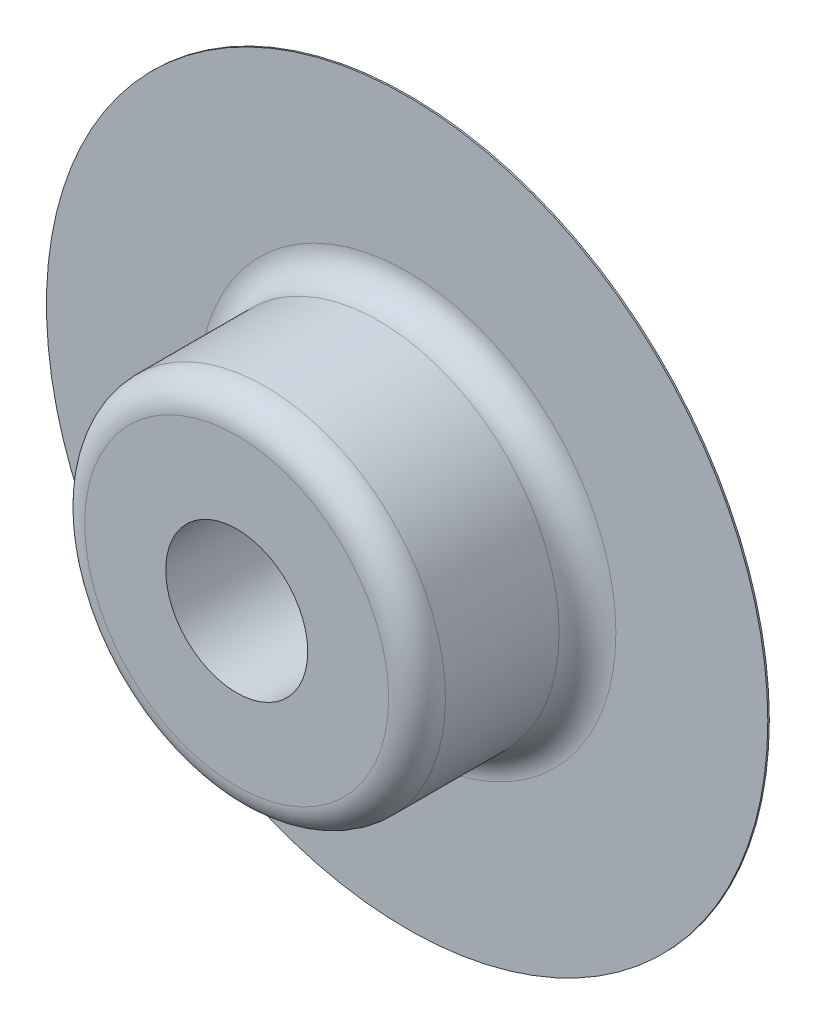
ISO-10303-21;
HEADER;
FILE_DESCRIPTION(('STEP AP214'),'2;1');
FILE_NAME('part.step','',(''),(''),'','','');
FILE_SCHEMA(('AUTOMOTIVE_DESIGN { 1 0 10303 214 1 1 1 1 }'));
ENDSEC;
DATA;
#1=APPLICATION_CONTEXT('core data for automotive mechanical design processes');
#2=APPLICATION_PROTOCOL_DEFINITION('international standard','automotive_design',2000,#1);
#3=PRODUCT_CONTEXT('',#1,'mechanical');
#4=PRODUCT('Part','Part','',(#3));
#5=PRODUCT_RELATED_PRODUCT_CATEGORY('part','',(#4));
#6=PRODUCT_DEFINITION_FORMATION('','',#4);
#7=PRODUCT_DEFINITION_CONTEXT('part definition',#1,'design');
#8=PRODUCT_DEFINITION('design','',#6,#7);
#9=PRODUCT_DEFINITION_SHAPE('','',#8);
#10=(LENGTH_UNIT() NAMED_UNIT(*) SI_UNIT(.MILLI.,.METRE.));
#11=(NAMED_UNIT(*) PLANE_ANGLE_UNIT() SI_UNIT($,.RADIAN.));
#12=(NAMED_UNIT(*) SI_UNIT($,.STERADIAN.) SOLID_ANGLE_UNIT());
#13=UNCERTAINTY_MEASURE_WITH_UNIT(LENGTH_MEASURE(1.E-05),#10,'distance_accuracy_value','');
#14=(GEOMETRIC_REPRESENTATION_CONTEXT(3) GLOBAL_UNCERTAINTY_ASSIGNED_CONTEXT((#13)) GLOBAL_UNIT_ASSIGNED_CONTEXT((#10,
#11,#12)) REPRESENTATION_CONTEXT('',''));
#15=CARTESIAN_POINT('',(0.,0.,0.));
#16=DIRECTION('',(0.,0.,1.));
#17=DIRECTION('',(1.,0.,0.));
#18=AXIS2_PLACEMENT_3D('',#15,#16,#17);
#19=CARTESIAN_POINT('',(0.,0.,0.054));
#20=DIRECTION('',(0.,0.,-1.));
#21=DIRECTION('',(-1.,0.,0.));
#22=AXIS2_PLACEMENT_3D('',#19,#20,#21);
#23=CYLINDRICAL_SURFACE('',#22,12.7);
#24=CARTESIAN_POINT('',(0.,0.,0.054));
#25=DIRECTION('',(0.,0.,1.));
#26=DIRECTION('',(1.,0.,0.));
#27=AXIS2_PLACEMENT_3D('',#24,#25,#26);
#28=CIRCLE('',#27,12.7);
#29=CARTESIAN_POINT('',(12.7,0.,0.054));
#30=VERTEX_POINT('',#29);
#31=EDGE_CURVE('E51',#30,#30,#28,.T.);
#32=ORIENTED_EDGE('',*,*,#31,.F.);
#33=EDGE_LOOP('',(#32));
#34=FACE_BOUND('',#33,.T.);
#35=CARTESIAN_POINT('',(0.,0.,0.));
#36=DIRECTION('',(0.,0.,1.));
#37=DIRECTION('',(1.,0.,0.));
#38=AXIS2_PLACEMENT_3D('',#35,#36,#37);
#39=CIRCLE('',#38,12.7);
#40=CARTESIAN_POINT('',(12.7,0.,0.));
#41=VERTEX_POINT('',#40);
#42=EDGE_CURVE('E55',#41,#41,#39,.T.);
#43=ORIENTED_EDGE('',*,*,#42,.T.);
#44=EDGE_LOOP('',(#43));
#45=FACE_BOUND('',#44,.T.);
#46=ADVANCED_FACE('F31',(#34,#45),#23,.T.);
#47=CARTESIAN_POINT('',(0.,0.,0.054));
#48=DIRECTION('',(0.,0.,1.));
#49=DIRECTION('',(1.,0.,0.));
#50=AXIS2_PLACEMENT_3D('',#47,#48,#49);
#51=PLANE('',#50);
#52=CARTESIAN_POINT('',(0.,0.,0.054));
#53=DIRECTION('',(0.,0.,1.));
#54=DIRECTION('',(1.,0.,0.));
#55=AXIS2_PLACEMENT_3D('',#52,#53,#54);
#56=CIRCLE('',#55,7.35);
#57=CARTESIAN_POINT('',(7.35,0.,0.054));
#58=VERTEX_POINT('',#57);
#59=EDGE_CURVE('E38',#58,#58,#56,.F.);
#60=ORIENTED_EDGE('',*,*,#59,.T.);
#61=EDGE_LOOP('',(#60));
#62=FACE_BOUND('',#61,.T.);
#63=ORIENTED_EDGE('',*,*,#31,.T.);
#64=EDGE_LOOP('',(#63));
#65=FACE_BOUND('',#64,.T.);
#66=ADVANCED_FACE('F81',(#62,#65),#51,.T.);
#67=CARTESIAN_POINT('',(0.,0.,0.));
#68=DIRECTION('',(0.,0.,1.));
#69=DIRECTION('',(1.,0.,0.));
#70=AXIS2_PLACEMENT_3D('',#67,#68,#69);
#71=PLANE('',#70);
#72=CARTESIAN_POINT('',(0.,0.,0.));
#73=DIRECTION('',(0.,0.,1.));
#74=DIRECTION('',(1.,0.,0.));
#75=AXIS2_PLACEMENT_3D('',#72,#73,#74);
#76=CIRCLE('',#75,2.5);
#77=CARTESIAN_POINT('',(2.5,0.,0.));
#78=VERTEX_POINT('',#77);
#79=EDGE_CURVE('E56',#78,#78,#76,.T.);
#80=ORIENTED_EDGE('',*,*,#79,.T.);
#81=EDGE_LOOP('',(#80));
#82=FACE_BOUND('',#81,.T.);
#83=ORIENTED_EDGE('',*,*,#42,.F.);
#84=EDGE_LOOP('',(#83));
#85=FACE_BOUND('',#84,.T.);
#86=ADVANCED_FACE('F64',(#82,#85),#71,.F.);
#87=CARTESIAN_POINT('',(0.,0.,6.054));
#88=DIRECTION('',(0.,0.,-1.));
#89=DIRECTION('',(-1.,0.,0.));
#90=AXIS2_PLACEMENT_3D('',#87,#88,#89);
#91=CYLINDRICAL_SURFACE('',#90,6.35);
#92=CARTESIAN_POINT('',(0.,0.,1.054));
#93=DIRECTION('',(0.,0.,1.));
#94=DIRECTION('',(1.,0.,0.));
#95=AXIS2_PLACEMENT_3D('',#92,#93,#94);
#96=CIRCLE('',#95,6.35);
#97=CARTESIAN_POINT('',(6.35,0.,1.054));
#98=VERTEX_POINT('',#97);
#99=EDGE_CURVE('E42',#98,#98,#96,.T.);
#100=ORIENTED_EDGE('',*,*,#99,.T.);
#101=EDGE_LOOP('',(#100));
#102=FACE_BOUND('',#101,.T.);
#103=CARTESIAN_POINT('',(0.,0.,5.054));
#104=DIRECTION('',(0.,0.,1.));
#105=DIRECTION('',(1.,0.,0.));
#106=AXIS2_PLACEMENT_3D('',#103,#104,#105);
#107=CIRCLE('',#106,6.35);
#108=CARTESIAN_POINT('',(6.35,0.,5.054));
#109=VERTEX_POINT('',#108);
#110=EDGE_CURVE('E46',#109,#109,#107,.F.);
#111=ORIENTED_EDGE('',*,*,#110,.T.);
#112=EDGE_LOOP('',(#111));
#113=FACE_BOUND('',#112,.T.);
#114=ADVANCED_FACE('F78',(#102,#113),#91,.T.);
#115=CARTESIAN_POINT('',(0.,0.,6.054));
#116=DIRECTION('',(0.,0.,1.));
#117=DIRECTION('',(1.,0.,0.));
#118=AXIS2_PLACEMENT_3D('',#115,#116,#117);
#119=PLANE('',#118);
#120=CARTESIAN_POINT('',(0.,0.,6.054));
#121=DIRECTION('',(0.,0.,1.));
#122=DIRECTION('',(1.,0.,0.));
#123=AXIS2_PLACEMENT_3D('',#120,#121,#122);
#124=CIRCLE('',#123,5.35);
#125=CARTESIAN_POINT('',(5.35,0.,6.054));
#126=VERTEX_POINT('',#125);
#127=EDGE_CURVE('E10',#126,#126,#124,.T.);
#128=ORIENTED_EDGE('',*,*,#127,.T.);
#129=EDGE_LOOP('',(#128));
#130=FACE_BOUND('',#129,.T.);
#131=CARTESIAN_POINT('',(0.,0.,6.054));
#132=DIRECTION('',(0.,0.,1.));
#133=DIRECTION('',(1.,0.,0.));
#134=AXIS2_PLACEMENT_3D('',#131,#132,#133);
#135=CIRCLE('',#134,2.5);
#136=CARTESIAN_POINT('',(2.5,0.,6.054));
#137=VERTEX_POINT('',#136);
#138=EDGE_CURVE('E52',#137,#137,#135,.T.);
#139=ORIENTED_EDGE('',*,*,#138,.F.);
#140=EDGE_LOOP('',(#139));
#141=FACE_BOUND('',#140,.T.);
#142=ADVANCED_FACE('F70',(#130,#141),#119,.T.);
#143=CARTESIAN_POINT('',(0.,0.,0.));
#144=DIRECTION('',(0.,0.,1.));
#145=DIRECTION('',(1.,0.,0.));
#146=AXIS2_PLACEMENT_3D('',#143,#144,#145);
#147=CYLINDRICAL_SURFACE('',#146,2.5);
#148=ORIENTED_EDGE('',*,*,#138,.T.);
#149=EDGE_LOOP('',(#148));
#150=FACE_BOUND('',#149,.T.);
#151=ORIENTED_EDGE('',*,*,#79,.F.);
#152=EDGE_LOOP('',(#151));
#153=FACE_BOUND('',#152,.T.);
#154=ADVANCED_FACE('F67',(#150,#153),#147,.F.);
#155=CARTESIAN_POINT('',(0.,0.,1.054));
#156=DIRECTION('',(0.,0.,1.));
#157=DIRECTION('',(1.,0.,0.));
#158=AXIS2_PLACEMENT_3D('',#155,#156,#157);
#159=TOROIDAL_SURFACE('',#158,7.35,1.);
#160=ORIENTED_EDGE('',*,*,#59,.F.);
#161=EDGE_LOOP('',(#160));
#162=FACE_BOUND('',#161,.T.);
#163=ORIENTED_EDGE('',*,*,#99,.F.);
#164=EDGE_LOOP('',(#163));
#165=FACE_BOUND('',#164,.T.);
#166=ADVANCED_FACE('F69',(#162,#165),#159,.F.);
#167=CARTESIAN_POINT('',(0.,0.,5.054));
#168=DIRECTION('',(0.,0.,1.));
#169=DIRECTION('',(1.,0.,0.));
#170=AXIS2_PLACEMENT_3D('',#167,#168,#169);
#171=TOROIDAL_SURFACE('',#170,5.35,1.);
#172=ORIENTED_EDGE('',*,*,#110,.F.);
#173=EDGE_LOOP('',(#172));
#174=FACE_BOUND('',#173,.T.);
#175=ORIENTED_EDGE('',*,*,#127,.F.);
#176=EDGE_LOOP('',(#175));
#177=FACE_BOUND('',#176,.T.);
#178=ADVANCED_FACE('F33',(#174,#177),#171,.T.);
#179=CLOSED_SHELL('',(#46,#66,#86,#114,#142,#154,#166,#178));
#180=MANIFOLD_SOLID_BREP('B2',#179);
#181=ADVANCED_BREP_SHAPE_REPRESENTATION('',(#18,#180),#14);
#182=SHAPE_DEFINITION_REPRESENTATION(#9,#181);
ENDSEC;
END-ISO-10303-21;
